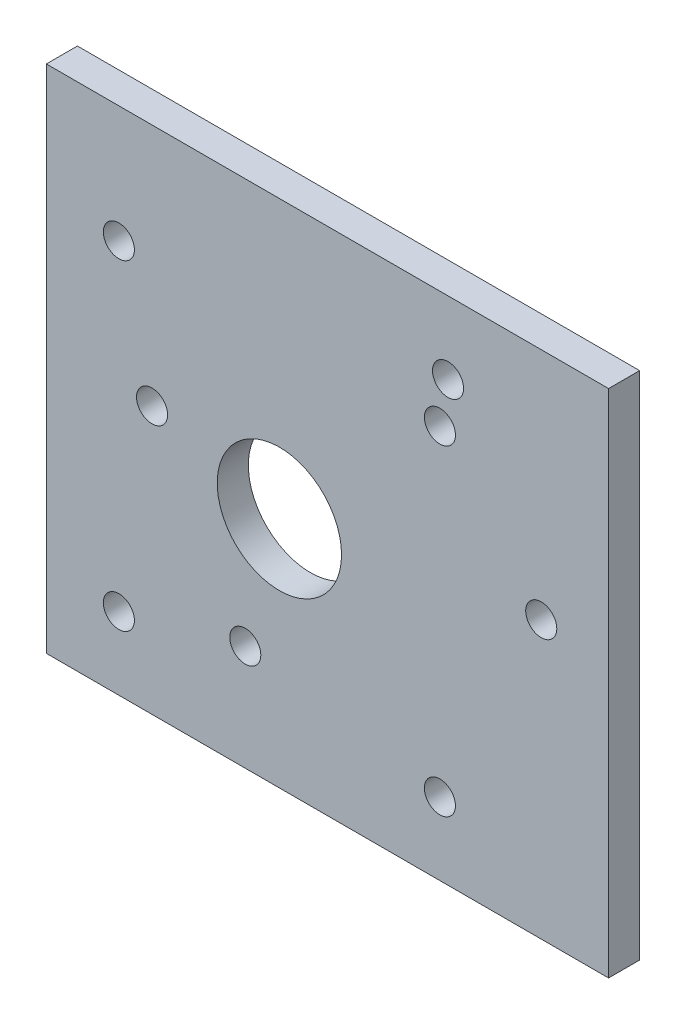
ISO-10303-21;
HEADER;
FILE_DESCRIPTION(('STEP AP214'),'2;1');
FILE_NAME('part.step','',(''),(''),'','','');
FILE_SCHEMA(('AUTOMOTIVE_DESIGN { 1 0 10303 214 1 1 1 1 }'));
ENDSEC;
DATA;
#1=APPLICATION_CONTEXT('core data for automotive mechanical design processes');
#2=APPLICATION_PROTOCOL_DEFINITION('international standard','automotive_design',2000,#1);
#3=PRODUCT_CONTEXT('',#1,'mechanical');
#4=PRODUCT('Part','Part','',(#3));
#5=PRODUCT_RELATED_PRODUCT_CATEGORY('part','',(#4));
#6=PRODUCT_DEFINITION_FORMATION('','',#4);
#7=PRODUCT_DEFINITION_CONTEXT('part definition',#1,'design');
#8=PRODUCT_DEFINITION('design','',#6,#7);
#9=PRODUCT_DEFINITION_SHAPE('','',#8);
#10=(LENGTH_UNIT() NAMED_UNIT(*) SI_UNIT(.MILLI.,.METRE.));
#11=(NAMED_UNIT(*) PLANE_ANGLE_UNIT() SI_UNIT($,.RADIAN.));
#12=(NAMED_UNIT(*) SI_UNIT($,.STERADIAN.) SOLID_ANGLE_UNIT());
#13=UNCERTAINTY_MEASURE_WITH_UNIT(LENGTH_MEASURE(1.E-05),#10,'distance_accuracy_value','');
#14=(GEOMETRIC_REPRESENTATION_CONTEXT(3) GLOBAL_UNCERTAINTY_ASSIGNED_CONTEXT((#13)) GLOBAL_UNIT_ASSIGNED_CONTEXT((#10,
#11,#12)) REPRESENTATION_CONTEXT('',''));
#15=CARTESIAN_POINT('',(0.,0.,0.));
#16=DIRECTION('',(0.,0.,1.));
#17=DIRECTION('',(1.,0.,0.));
#18=AXIS2_PLACEMENT_3D('',#15,#16,#17);
#19=CARTESIAN_POINT('',(0.,0.,1.5));
#20=DIRECTION('',(0.,0.,1.));
#21=DIRECTION('',(1.,0.,0.));
#22=AXIS2_PLACEMENT_3D('',#19,#20,#21);
#23=PLANE('',#22);
#24=DIRECTION('',(0.,-1.,0.));
#25=VECTOR('',#24,1.);
#26=CARTESIAN_POINT('',(31.7846096908265,-22.5,1.5));
#27=LINE('',#26,#25);
#28=CARTESIAN_POINT('',(31.7846096908265,26.79,1.5));
#29=VERTEX_POINT('',#28);
#30=CARTESIAN_POINT('',(31.7846096908265,-22.5,1.5));
#31=VERTEX_POINT('',#30);
#32=EDGE_CURVE('E79',#29,#31,#27,.T.);
#33=ORIENTED_EDGE('',*,*,#32,.F.);
#34=DIRECTION('',(1.,0.,0.));
#35=VECTOR('',#34,1.);
#36=CARTESIAN_POINT('',(-22.5,26.79,1.5));
#37=LINE('',#36,#35);
#38=CARTESIAN_POINT('',(-22.5,26.79,1.5));
#39=VERTEX_POINT('',#38);
#40=EDGE_CURVE('E227',#39,#29,#37,.T.);
#41=ORIENTED_EDGE('',*,*,#40,.F.);
#42=DIRECTION('',(0.,-1.,0.));
#43=VECTOR('',#42,1.);
#44=CARTESIAN_POINT('',(-22.5,22.5,1.5));
#45=LINE('',#44,#43);
#46=CARTESIAN_POINT('',(-22.5,-22.5,1.5));
#47=VERTEX_POINT('',#46);
#48=EDGE_CURVE('E63',#39,#47,#45,.T.);
#49=ORIENTED_EDGE('',*,*,#48,.T.);
#50=DIRECTION('',(1.,0.,0.));
#51=VECTOR('',#50,1.);
#52=CARTESIAN_POINT('',(-22.5,-22.5,1.5));
#53=LINE('',#52,#51);
#54=EDGE_CURVE('E91',#47,#31,#53,.T.);
#55=ORIENTED_EDGE('',*,*,#54,.T.);
#56=EDGE_LOOP('',(#33,#41,#49,#55));
#57=FACE_BOUND('',#56,.T.);
#58=CARTESIAN_POINT('',(-3.29422863405993,-12.29422863406,1.5));
#59=DIRECTION('',(0.,0.,1.));
#60=DIRECTION('',(1.,0.,0.));
#61=AXIS2_PLACEMENT_3D('',#58,#59,#60);
#62=CIRCLE('',#61,1.5);
#63=CARTESIAN_POINT('',(-1.79422863405993,-12.29422863406,1.5));
#64=VERTEX_POINT('',#63);
#65=EDGE_CURVE('E116',#64,#64,#62,.T.);
#66=ORIENTED_EDGE('',*,*,#65,.F.);
#67=EDGE_LOOP('',(#66));
#68=FACE_BOUND('',#67,.T.);
#69=CARTESIAN_POINT('',(25.2846096908265,4.20577136594008,1.5));
#70=DIRECTION('',(0.,0.,1.));
#71=DIRECTION('',(1.,0.,0.));
#72=AXIS2_PLACEMENT_3D('',#69,#70,#71);
#73=CIRCLE('',#72,1.5);
#74=CARTESIAN_POINT('',(26.7846096908265,4.20577136594008,1.5));
#75=VERTEX_POINT('',#74);
#76=EDGE_CURVE('E146',#75,#75,#73,.T.);
#77=ORIENTED_EDGE('',*,*,#76,.F.);
#78=EDGE_LOOP('',(#77));
#79=FACE_BOUND('',#78,.T.);
#80=CARTESIAN_POINT('',(16.2846096908265,19.79422863406,1.5));
#81=DIRECTION('',(0.,0.,1.));
#82=DIRECTION('',(1.,0.,0.));
#83=AXIS2_PLACEMENT_3D('',#80,#81,#82);
#84=CIRCLE('',#83,1.5);
#85=CARTESIAN_POINT('',(17.7846096908265,19.79422863406,1.5));
#86=VERTEX_POINT('',#85);
#87=EDGE_CURVE('E142',#86,#86,#84,.T.);
#88=ORIENTED_EDGE('',*,*,#87,.F.);
#89=EDGE_LOOP('',(#88));
#90=FACE_BOUND('',#89,.T.);
#91=CARTESIAN_POINT('',(-12.29422863406,3.29422863405993,1.5));
#92=DIRECTION('',(0.,0.,1.));
#93=DIRECTION('',(1.,0.,0.));
#94=AXIS2_PLACEMENT_3D('',#91,#92,#93);
#95=CIRCLE('',#94,1.5);
#96=CARTESIAN_POINT('',(-10.7942286340599,3.29422863405993,1.5));
#97=VERTEX_POINT('',#96);
#98=EDGE_CURVE('E136',#97,#97,#95,.T.);
#99=ORIENTED_EDGE('',*,*,#98,.F.);
#100=EDGE_LOOP('',(#99));
#101=FACE_BOUND('',#100,.T.);
#102=CARTESIAN_POINT('',(-15.4999999999997,-15.5,1.5));
#103=DIRECTION('',(0.,0.,1.));
#104=DIRECTION('',(1.,0.,0.));
#105=AXIS2_PLACEMENT_3D('',#102,#103,#104);
#106=CIRCLE('',#105,1.5);
#107=CARTESIAN_POINT('',(-13.9999999999997,-15.5,1.5));
#108=VERTEX_POINT('',#107);
#109=EDGE_CURVE('E131',#108,#108,#106,.T.);
#110=ORIENTED_EDGE('',*,*,#109,.F.);
#111=EDGE_LOOP('',(#110));
#112=FACE_BOUND('',#111,.T.);
#113=CARTESIAN_POINT('',(15.5000000000003,-15.5,1.5));
#114=DIRECTION('',(0.,0.,1.));
#115=DIRECTION('',(1.,0.,0.));
#116=AXIS2_PLACEMENT_3D('',#113,#114,#115);
#117=CIRCLE('',#116,1.5);
#118=CARTESIAN_POINT('',(17.0000000000003,-15.5,1.5));
#119=VERTEX_POINT('',#118);
#120=EDGE_CURVE('E126',#119,#119,#117,.T.);
#121=ORIENTED_EDGE('',*,*,#120,.F.);
#122=EDGE_LOOP('',(#121));
#123=FACE_BOUND('',#122,.T.);
#124=CARTESIAN_POINT('',(15.5,15.5,1.5));
#125=DIRECTION('',(0.,0.,1.));
#126=DIRECTION('',(1.,0.,0.));
#127=AXIS2_PLACEMENT_3D('',#124,#125,#126);
#128=CIRCLE('',#127,1.5);
#129=CARTESIAN_POINT('',(17.,15.5,1.5));
#130=VERTEX_POINT('',#129);
#131=EDGE_CURVE('E121',#130,#130,#128,.T.);
#132=ORIENTED_EDGE('',*,*,#131,.F.);
#133=EDGE_LOOP('',(#132));
#134=FACE_BOUND('',#133,.T.);
#135=CARTESIAN_POINT('',(-15.5,15.5,1.5));
#136=DIRECTION('',(0.,0.,1.));
#137=DIRECTION('',(1.,0.,0.));
#138=AXIS2_PLACEMENT_3D('',#135,#136,#137);
#139=CIRCLE('',#138,1.5);
#140=CARTESIAN_POINT('',(-14.,15.5,1.5));
#141=VERTEX_POINT('',#140);
#142=EDGE_CURVE('E115',#141,#141,#139,.T.);
#143=ORIENTED_EDGE('',*,*,#142,.F.);
#144=EDGE_LOOP('',(#143));
#145=FACE_BOUND('',#144,.T.);
#146=CARTESIAN_POINT('',(0.,0.,1.5));
#147=DIRECTION('',(0.,0.,1.));
#148=DIRECTION('',(1.,0.,0.));
#149=AXIS2_PLACEMENT_3D('',#146,#147,#148);
#150=CIRCLE('',#149,6.);
#151=CARTESIAN_POINT('',(6.,0.,1.5));
#152=VERTEX_POINT('',#151);
#153=EDGE_CURVE('E108',#152,#152,#150,.T.);
#154=ORIENTED_EDGE('',*,*,#153,.F.);
#155=EDGE_LOOP('',(#154));
#156=FACE_BOUND('',#155,.T.);
#157=ADVANCED_FACE('F39',(#57,#68,#79,#90,#101,#112,#123,#134,#145,#156),#23,.T.);
#158=CARTESIAN_POINT('',(0.,0.,-1.5));
#159=DIRECTION('',(0.,0.,1.));
#160=DIRECTION('',(1.,0.,0.));
#161=AXIS2_PLACEMENT_3D('',#158,#159,#160);
#162=PLANE('',#161);
#163=CARTESIAN_POINT('',(-3.29422863405993,-12.29422863406,-1.5));
#164=DIRECTION('',(0.,0.,1.));
#165=DIRECTION('',(1.,0.,0.));
#166=AXIS2_PLACEMENT_3D('',#163,#164,#165);
#167=CIRCLE('',#166,1.5);
#168=CARTESIAN_POINT('',(-1.79422863405993,-12.29422863406,-1.5));
#169=VERTEX_POINT('',#168);
#170=EDGE_CURVE('E147',#169,#169,#167,.T.);
#171=ORIENTED_EDGE('',*,*,#170,.T.);
#172=EDGE_LOOP('',(#171));
#173=FACE_BOUND('',#172,.T.);
#174=CARTESIAN_POINT('',(25.2846096908265,4.20577136594008,-1.5));
#175=DIRECTION('',(0.,0.,1.));
#176=DIRECTION('',(1.,0.,0.));
#177=AXIS2_PLACEMENT_3D('',#174,#175,#176);
#178=CIRCLE('',#177,1.5);
#179=CARTESIAN_POINT('',(26.7846096908265,4.20577136594008,-1.5));
#180=VERTEX_POINT('',#179);
#181=EDGE_CURVE('E143',#180,#180,#178,.T.);
#182=ORIENTED_EDGE('',*,*,#181,.T.);
#183=EDGE_LOOP('',(#182));
#184=FACE_BOUND('',#183,.T.);
#185=CARTESIAN_POINT('',(16.2846096908265,19.79422863406,-1.5));
#186=DIRECTION('',(0.,0.,1.));
#187=DIRECTION('',(1.,0.,0.));
#188=AXIS2_PLACEMENT_3D('',#185,#186,#187);
#189=CIRCLE('',#188,1.5);
#190=CARTESIAN_POINT('',(17.7846096908265,19.79422863406,-1.5));
#191=VERTEX_POINT('',#190);
#192=EDGE_CURVE('E138',#191,#191,#189,.T.);
#193=ORIENTED_EDGE('',*,*,#192,.T.);
#194=EDGE_LOOP('',(#193));
#195=FACE_BOUND('',#194,.T.);
#196=CARTESIAN_POINT('',(-12.29422863406,3.29422863405993,-1.5));
#197=DIRECTION('',(0.,0.,1.));
#198=DIRECTION('',(1.,0.,0.));
#199=AXIS2_PLACEMENT_3D('',#196,#197,#198);
#200=CIRCLE('',#199,1.5);
#201=CARTESIAN_POINT('',(-10.7942286340599,3.29422863405993,-1.5));
#202=VERTEX_POINT('',#201);
#203=EDGE_CURVE('E132',#202,#202,#200,.T.);
#204=ORIENTED_EDGE('',*,*,#203,.T.);
#205=EDGE_LOOP('',(#204));
#206=FACE_BOUND('',#205,.T.);
#207=CARTESIAN_POINT('',(-15.4999999999997,-15.5,-1.5));
#208=DIRECTION('',(0.,0.,1.));
#209=DIRECTION('',(1.,0.,0.));
#210=AXIS2_PLACEMENT_3D('',#207,#208,#209);
#211=CIRCLE('',#210,1.5);
#212=CARTESIAN_POINT('',(-13.9999999999997,-15.5,-1.5));
#213=VERTEX_POINT('',#212);
#214=EDGE_CURVE('E127',#213,#213,#211,.T.);
#215=ORIENTED_EDGE('',*,*,#214,.T.);
#216=EDGE_LOOP('',(#215));
#217=FACE_BOUND('',#216,.T.);
#218=CARTESIAN_POINT('',(15.5000000000003,-15.5,-1.5));
#219=DIRECTION('',(0.,0.,1.));
#220=DIRECTION('',(1.,0.,0.));
#221=AXIS2_PLACEMENT_3D('',#218,#219,#220);
#222=CIRCLE('',#221,1.5);
#223=CARTESIAN_POINT('',(17.0000000000003,-15.5,-1.5));
#224=VERTEX_POINT('',#223);
#225=EDGE_CURVE('E122',#224,#224,#222,.T.);
#226=ORIENTED_EDGE('',*,*,#225,.T.);
#227=EDGE_LOOP('',(#226));
#228=FACE_BOUND('',#227,.T.);
#229=CARTESIAN_POINT('',(15.5,15.5,-1.5));
#230=DIRECTION('',(0.,0.,1.));
#231=DIRECTION('',(1.,0.,0.));
#232=AXIS2_PLACEMENT_3D('',#229,#230,#231);
#233=CIRCLE('',#232,1.5);
#234=CARTESIAN_POINT('',(17.,15.5,-1.5));
#235=VERTEX_POINT('',#234);
#236=EDGE_CURVE('E117',#235,#235,#233,.T.);
#237=ORIENTED_EDGE('',*,*,#236,.T.);
#238=EDGE_LOOP('',(#237));
#239=FACE_BOUND('',#238,.T.);
#240=CARTESIAN_POINT('',(-15.5,15.5,-1.5));
#241=DIRECTION('',(0.,0.,1.));
#242=DIRECTION('',(1.,0.,0.));
#243=AXIS2_PLACEMENT_3D('',#240,#241,#242);
#244=CIRCLE('',#243,1.5);
#245=CARTESIAN_POINT('',(-14.,15.5,-1.5));
#246=VERTEX_POINT('',#245);
#247=EDGE_CURVE('E111',#246,#246,#244,.T.);
#248=ORIENTED_EDGE('',*,*,#247,.T.);
#249=EDGE_LOOP('',(#248));
#250=FACE_BOUND('',#249,.T.);
#251=DIRECTION('',(-1.,0.,0.));
#252=VECTOR('',#251,1.);
#253=CARTESIAN_POINT('',(-22.5,26.79,-1.5));
#254=LINE('',#253,#252);
#255=CARTESIAN_POINT('',(31.7846096908265,26.79,-1.5));
#256=VERTEX_POINT('',#255);
#257=CARTESIAN_POINT('',(-22.5,26.79,-1.5));
#258=VERTEX_POINT('',#257);
#259=EDGE_CURVE('E137',#256,#258,#254,.T.);
#260=ORIENTED_EDGE('',*,*,#259,.F.);
#261=DIRECTION('',(0.,-1.,0.));
#262=VECTOR('',#261,1.);
#263=CARTESIAN_POINT('',(31.7846096908265,0.,-1.5));
#264=LINE('',#263,#262);
#265=CARTESIAN_POINT('',(31.7846096908265,-22.5,-1.5));
#266=VERTEX_POINT('',#265);
#267=EDGE_CURVE('E55',#256,#266,#264,.T.);
#268=ORIENTED_EDGE('',*,*,#267,.T.);
#269=DIRECTION('',(1.,0.,0.));
#270=VECTOR('',#269,1.);
#271=CARTESIAN_POINT('',(-22.5,-22.5,-1.5));
#272=LINE('',#271,#270);
#273=CARTESIAN_POINT('',(-22.5,-22.5,-1.5));
#274=VERTEX_POINT('',#273);
#275=EDGE_CURVE('E93',#274,#266,#272,.T.);
#276=ORIENTED_EDGE('',*,*,#275,.F.);
#277=DIRECTION('',(0.,-1.,0.));
#278=VECTOR('',#277,1.);
#279=CARTESIAN_POINT('',(-22.5,22.5,-1.5));
#280=LINE('',#279,#278);
#281=EDGE_CURVE('E105',#258,#274,#280,.T.);
#282=ORIENTED_EDGE('',*,*,#281,.F.);
#283=EDGE_LOOP('',(#260,#268,#276,#282));
#284=FACE_BOUND('',#283,.T.);
#285=CARTESIAN_POINT('',(0.,0.,-1.5));
#286=DIRECTION('',(0.,0.,1.));
#287=DIRECTION('',(1.,0.,0.));
#288=AXIS2_PLACEMENT_3D('',#285,#286,#287);
#289=CIRCLE('',#288,6.);
#290=CARTESIAN_POINT('',(6.,0.,-1.5));
#291=VERTEX_POINT('',#290);
#292=EDGE_CURVE('E175',#291,#291,#289,.T.);
#293=ORIENTED_EDGE('',*,*,#292,.T.);
#294=EDGE_LOOP('',(#293));
#295=FACE_BOUND('',#294,.T.);
#296=ADVANCED_FACE('F182',(#173,#184,#195,#206,#217,#228,#239,#250,#284,#295),#162,.F.);
#297=CARTESIAN_POINT('',(-22.5,22.5,1.5));
#298=DIRECTION('',(1.,0.,0.));
#299=DIRECTION('',(0.,1.,0.));
#300=AXIS2_PLACEMENT_3D('',#297,#298,#299);
#301=PLANE('',#300);
#302=ORIENTED_EDGE('',*,*,#281,.T.);
#303=DIRECTION('',(0.,0.,-1.));
#304=VECTOR('',#303,1.);
#305=CARTESIAN_POINT('',(-22.5,-22.5,1.5));
#306=LINE('',#305,#304);
#307=EDGE_CURVE('E48',#47,#274,#306,.T.);
#308=ORIENTED_EDGE('',*,*,#307,.F.);
#309=ORIENTED_EDGE('',*,*,#48,.F.);
#310=DIRECTION('',(0.,0.,1.));
#311=VECTOR('',#310,1.);
#312=CARTESIAN_POINT('',(-22.5,26.79,1.5));
#313=LINE('',#312,#311);
#314=EDGE_CURVE('E230',#258,#39,#313,.T.);
#315=ORIENTED_EDGE('',*,*,#314,.F.);
#316=EDGE_LOOP('',(#302,#308,#309,#315));
#317=FACE_BOUND('',#316,.T.);
#318=ADVANCED_FACE('F41',(#317),#301,.F.);
#319=CARTESIAN_POINT('',(-22.5,-22.5,1.5));
#320=DIRECTION('',(0.,1.,0.));
#321=DIRECTION('',(0.,0.,1.));
#322=AXIS2_PLACEMENT_3D('',#319,#320,#321);
#323=PLANE('',#322);
#324=ORIENTED_EDGE('',*,*,#275,.T.);
#325=DIRECTION('',(0.,0.,1.));
#326=VECTOR('',#325,1.);
#327=CARTESIAN_POINT('',(31.7846096908265,-22.5,-2.79));
#328=LINE('',#327,#326);
#329=EDGE_CURVE('E82',#266,#31,#328,.T.);
#330=ORIENTED_EDGE('',*,*,#329,.T.);
#331=ORIENTED_EDGE('',*,*,#54,.F.);
#332=ORIENTED_EDGE('',*,*,#307,.T.);
#333=EDGE_LOOP('',(#324,#330,#331,#332));
#334=FACE_BOUND('',#333,.T.);
#335=ADVANCED_FACE('F89',(#334),#323,.F.);
#336=CARTESIAN_POINT('',(0.,0.,1.5));
#337=DIRECTION('',(0.,0.,-1.));
#338=DIRECTION('',(-1.,0.,0.));
#339=AXIS2_PLACEMENT_3D('',#336,#337,#338);
#340=CYLINDRICAL_SURFACE('',#339,6.);
#341=ORIENTED_EDGE('',*,*,#153,.T.);
#342=EDGE_LOOP('',(#341));
#343=FACE_BOUND('',#342,.T.);
#344=ORIENTED_EDGE('',*,*,#292,.F.);
#345=EDGE_LOOP('',(#344));
#346=FACE_BOUND('',#345,.T.);
#347=ADVANCED_FACE('F184',(#343,#346),#340,.F.);
#348=CARTESIAN_POINT('',(-15.5,15.5,-3.5));
#349=DIRECTION('',(0.,0.,1.));
#350=DIRECTION('',(1.,0.,0.));
#351=AXIS2_PLACEMENT_3D('',#348,#349,#350);
#352=CYLINDRICAL_SURFACE('',#351,1.5);
#353=ORIENTED_EDGE('',*,*,#142,.T.);
#354=EDGE_LOOP('',(#353));
#355=FACE_BOUND('',#354,.T.);
#356=ORIENTED_EDGE('',*,*,#247,.F.);
#357=EDGE_LOOP('',(#356));
#358=FACE_BOUND('',#357,.T.);
#359=ADVANCED_FACE('F186',(#355,#358),#352,.F.);
#360=CARTESIAN_POINT('',(15.5,15.5,-3.5));
#361=DIRECTION('',(0.,0.,1.));
#362=DIRECTION('',(1.,0.,0.));
#363=AXIS2_PLACEMENT_3D('',#360,#361,#362);
#364=CYLINDRICAL_SURFACE('',#363,1.5);
#365=ORIENTED_EDGE('',*,*,#131,.T.);
#366=EDGE_LOOP('',(#365));
#367=FACE_BOUND('',#366,.T.);
#368=ORIENTED_EDGE('',*,*,#236,.F.);
#369=EDGE_LOOP('',(#368));
#370=FACE_BOUND('',#369,.T.);
#371=ADVANCED_FACE('F193',(#367,#370),#364,.F.);
#372=CARTESIAN_POINT('',(15.5000000000003,-15.5,-3.5));
#373=DIRECTION('',(0.,0.,1.));
#374=DIRECTION('',(1.,0.,0.));
#375=AXIS2_PLACEMENT_3D('',#372,#373,#374);
#376=CYLINDRICAL_SURFACE('',#375,1.5);
#377=ORIENTED_EDGE('',*,*,#120,.T.);
#378=EDGE_LOOP('',(#377));
#379=FACE_BOUND('',#378,.T.);
#380=ORIENTED_EDGE('',*,*,#225,.F.);
#381=EDGE_LOOP('',(#380));
#382=FACE_BOUND('',#381,.T.);
#383=ADVANCED_FACE('F254',(#379,#382),#376,.F.);
#384=CARTESIAN_POINT('',(-15.4999999999997,-15.5,-3.5));
#385=DIRECTION('',(0.,0.,1.));
#386=DIRECTION('',(1.,0.,0.));
#387=AXIS2_PLACEMENT_3D('',#384,#385,#386);
#388=CYLINDRICAL_SURFACE('',#387,1.5);
#389=ORIENTED_EDGE('',*,*,#109,.T.);
#390=EDGE_LOOP('',(#389));
#391=FACE_BOUND('',#390,.T.);
#392=ORIENTED_EDGE('',*,*,#214,.F.);
#393=EDGE_LOOP('',(#392));
#394=FACE_BOUND('',#393,.T.);
#395=ADVANCED_FACE('F259',(#391,#394),#388,.F.);
#396=CARTESIAN_POINT('',(-12.29422863406,3.29422863405993,-3.5));
#397=DIRECTION('',(0.,0.,1.));
#398=DIRECTION('',(1.,0.,0.));
#399=AXIS2_PLACEMENT_3D('',#396,#397,#398);
#400=CYLINDRICAL_SURFACE('',#399,1.5);
#401=ORIENTED_EDGE('',*,*,#98,.T.);
#402=EDGE_LOOP('',(#401));
#403=FACE_BOUND('',#402,.T.);
#404=ORIENTED_EDGE('',*,*,#203,.F.);
#405=EDGE_LOOP('',(#404));
#406=FACE_BOUND('',#405,.T.);
#407=ADVANCED_FACE('F237',(#403,#406),#400,.F.);
#408=CARTESIAN_POINT('',(16.2846096908265,19.79422863406,-3.5));
#409=DIRECTION('',(0.,0.,1.));
#410=DIRECTION('',(1.,0.,0.));
#411=AXIS2_PLACEMENT_3D('',#408,#409,#410);
#412=CYLINDRICAL_SURFACE('',#411,1.5);
#413=ORIENTED_EDGE('',*,*,#87,.T.);
#414=EDGE_LOOP('',(#413));
#415=FACE_BOUND('',#414,.T.);
#416=ORIENTED_EDGE('',*,*,#192,.F.);
#417=EDGE_LOOP('',(#416));
#418=FACE_BOUND('',#417,.T.);
#419=ADVANCED_FACE('F270',(#415,#418),#412,.F.);
#420=CARTESIAN_POINT('',(25.2846096908265,4.20577136594008,-3.5));
#421=DIRECTION('',(0.,0.,1.));
#422=DIRECTION('',(1.,0.,0.));
#423=AXIS2_PLACEMENT_3D('',#420,#421,#422);
#424=CYLINDRICAL_SURFACE('',#423,1.5);
#425=ORIENTED_EDGE('',*,*,#76,.T.);
#426=EDGE_LOOP('',(#425));
#427=FACE_BOUND('',#426,.T.);
#428=ORIENTED_EDGE('',*,*,#181,.F.);
#429=EDGE_LOOP('',(#428));
#430=FACE_BOUND('',#429,.T.);
#431=ADVANCED_FACE('F275',(#427,#430),#424,.F.);
#432=CARTESIAN_POINT('',(-3.29422863405993,-12.29422863406,-3.5));
#433=DIRECTION('',(0.,0.,1.));
#434=DIRECTION('',(1.,0.,0.));
#435=AXIS2_PLACEMENT_3D('',#432,#433,#434);
#436=CYLINDRICAL_SURFACE('',#435,1.5);
#437=ORIENTED_EDGE('',*,*,#65,.T.);
#438=EDGE_LOOP('',(#437));
#439=FACE_BOUND('',#438,.T.);
#440=ORIENTED_EDGE('',*,*,#170,.F.);
#441=EDGE_LOOP('',(#440));
#442=FACE_BOUND('',#441,.T.);
#443=ADVANCED_FACE('F280',(#439,#442),#436,.F.);
#444=CARTESIAN_POINT('',(0.,26.79,0.));
#445=DIRECTION('',(0.,-1.,0.));
#446=DIRECTION('',(0.,0.,-1.));
#447=AXIS2_PLACEMENT_3D('',#444,#445,#446);
#448=PLANE('',#447);
#449=ORIENTED_EDGE('',*,*,#40,.T.);
#450=DIRECTION('',(0.,0.,-1.));
#451=VECTOR('',#450,1.);
#452=CARTESIAN_POINT('',(31.7846096908265,26.79,0.));
#453=LINE('',#452,#451);
#454=EDGE_CURVE('E11',#29,#256,#453,.T.);
#455=ORIENTED_EDGE('',*,*,#454,.T.);
#456=ORIENTED_EDGE('',*,*,#259,.T.);
#457=ORIENTED_EDGE('',*,*,#314,.T.);
#458=EDGE_LOOP('',(#449,#455,#456,#457));
#459=FACE_BOUND('',#458,.T.);
#460=ADVANCED_FACE('F287',(#459),#448,.F.);
#461=CARTESIAN_POINT('',(31.7846096908265,-22.5,-2.79));
#462=DIRECTION('',(-1.,0.,0.));
#463=DIRECTION('',(0.,-1.,0.));
#464=AXIS2_PLACEMENT_3D('',#461,#462,#463);
#465=PLANE('',#464);
#466=ORIENTED_EDGE('',*,*,#454,.F.);
#467=ORIENTED_EDGE('',*,*,#32,.T.);
#468=ORIENTED_EDGE('',*,*,#329,.F.);
#469=ORIENTED_EDGE('',*,*,#267,.F.);
#470=EDGE_LOOP('',(#466,#467,#468,#469));
#471=FACE_BOUND('',#470,.T.);
#472=ADVANCED_FACE('F81',(#471),#465,.F.);
#473=CLOSED_SHELL('',(#157,#296,#318,#335,#347,#359,#371,#383,#395,#407,#419,#431,#443,#460,#472));
#474=MANIFOLD_SOLID_BREP('B2',#473);
#475=ADVANCED_BREP_SHAPE_REPRESENTATION('',(#18,#474),#14);
#476=SHAPE_DEFINITION_REPRESENTATION(#9,#475);
ENDSEC;
END-ISO-10303-21;
